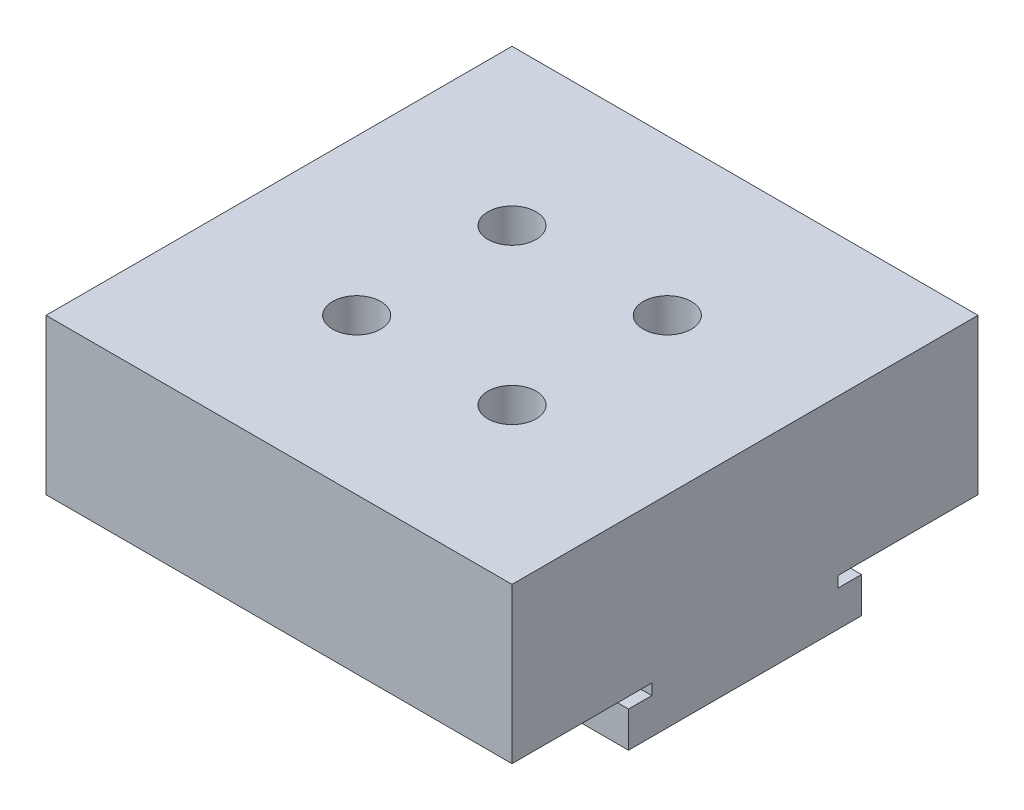
ISO-10303-21;
HEADER;
FILE_DESCRIPTION(('STEP AP214'),'2;1');
FILE_NAME('part.step','',(''),(''),'','','');
FILE_SCHEMA(('AUTOMOTIVE_DESIGN { 1 0 10303 214 1 1 1 1 }'));
ENDSEC;
DATA;
#1=APPLICATION_CONTEXT('core data for automotive mechanical design processes');
#2=APPLICATION_PROTOCOL_DEFINITION('international standard','automotive_design',2000,#1);
#3=PRODUCT_CONTEXT('',#1,'mechanical');
#4=PRODUCT('Part','Part','',(#3));
#5=PRODUCT_RELATED_PRODUCT_CATEGORY('part','',(#4));
#6=PRODUCT_DEFINITION_FORMATION('','',#4);
#7=PRODUCT_DEFINITION_CONTEXT('part definition',#1,'design');
#8=PRODUCT_DEFINITION('design','',#6,#7);
#9=PRODUCT_DEFINITION_SHAPE('','',#8);
#10=(LENGTH_UNIT() NAMED_UNIT(*) SI_UNIT(.MILLI.,.METRE.));
#11=(NAMED_UNIT(*) PLANE_ANGLE_UNIT() SI_UNIT($,.RADIAN.));
#12=(NAMED_UNIT(*) SI_UNIT($,.STERADIAN.) SOLID_ANGLE_UNIT());
#13=UNCERTAINTY_MEASURE_WITH_UNIT(LENGTH_MEASURE(1.E-05),#10,'distance_accuracy_value','');
#14=(GEOMETRIC_REPRESENTATION_CONTEXT(3) GLOBAL_UNCERTAINTY_ASSIGNED_CONTEXT((#13)) GLOBAL_UNIT_ASSIGNED_CONTEXT((#10,
#11,#12)) REPRESENTATION_CONTEXT('',''));
#15=CARTESIAN_POINT('',(0.,0.,0.));
#16=DIRECTION('',(0.,0.,1.));
#17=DIRECTION('',(1.,0.,0.));
#18=AXIS2_PLACEMENT_3D('',#15,#16,#17);
#19=CARTESIAN_POINT('',(0.,0.,0.));
#20=DIRECTION('',(0.,-1.,0.));
#21=DIRECTION('',(0.,0.,-1.));
#22=AXIS2_PLACEMENT_3D('',#19,#20,#21);
#23=PLANE('',#22);
#24=CARTESIAN_POINT('',(0.,0.,0.));
#25=DIRECTION('',(0.,-1.,0.));
#26=DIRECTION('',(0.,0.,-1.));
#27=AXIS2_PLACEMENT_3D('',#24,#25,#26);
#28=CIRCLE('',#27,3.);
#29=CARTESIAN_POINT('',(0.,0.,-3.));
#30=VERTEX_POINT('',#29);
#31=EDGE_CURVE('E206',#30,#30,#28,.T.);
#32=ORIENTED_EDGE('',*,*,#31,.F.);
#33=EDGE_LOOP('',(#32));
#34=FACE_BOUND('',#33,.T.);
#35=CARTESIAN_POINT('',(-5.,0.,-5.));
#36=DIRECTION('',(0.,-1.,0.));
#37=DIRECTION('',(0.,0.,-1.));
#38=AXIS2_PLACEMENT_3D('',#35,#36,#37);
#39=CIRCLE('',#38,3.5);
#40=CARTESIAN_POINT('',(-5.,0.,-8.5));
#41=VERTEX_POINT('',#40);
#42=EDGE_CURVE('E328',#41,#41,#39,.T.);
#43=ORIENTED_EDGE('',*,*,#42,.F.);
#44=EDGE_LOOP('',(#43));
#45=FACE_BOUND('',#44,.T.);
#46=CARTESIAN_POINT('',(5.,0.,-5.));
#47=DIRECTION('',(0.,-1.,0.));
#48=DIRECTION('',(0.,0.,-1.));
#49=AXIS2_PLACEMENT_3D('',#46,#47,#48);
#50=CIRCLE('',#49,3.5);
#51=CARTESIAN_POINT('',(5.,0.,-8.5));
#52=VERTEX_POINT('',#51);
#53=EDGE_CURVE('E342',#52,#52,#50,.T.);
#54=ORIENTED_EDGE('',*,*,#53,.F.);
#55=EDGE_LOOP('',(#54));
#56=FACE_BOUND('',#55,.T.);
#57=CARTESIAN_POINT('',(5.,0.,5.));
#58=DIRECTION('',(0.,-1.,0.));
#59=DIRECTION('',(0.,0.,-1.));
#60=AXIS2_PLACEMENT_3D('',#57,#58,#59);
#61=CIRCLE('',#60,3.5);
#62=CARTESIAN_POINT('',(5.,0.,1.5));
#63=VERTEX_POINT('',#62);
#64=EDGE_CURVE('E334',#63,#63,#61,.T.);
#65=ORIENTED_EDGE('',*,*,#64,.F.);
#66=EDGE_LOOP('',(#65));
#67=FACE_BOUND('',#66,.T.);
#68=CARTESIAN_POINT('',(-5.,0.,5.));
#69=DIRECTION('',(0.,-1.,0.));
#70=DIRECTION('',(0.,0.,-1.));
#71=AXIS2_PLACEMENT_3D('',#68,#69,#70);
#72=CIRCLE('',#71,3.5);
#73=CARTESIAN_POINT('',(-5.,0.,1.5));
#74=VERTEX_POINT('',#73);
#75=EDGE_CURVE('E333',#74,#74,#72,.T.);
#76=ORIENTED_EDGE('',*,*,#75,.F.);
#77=EDGE_LOOP('',(#76));
#78=FACE_BOUND('',#77,.T.);
#79=DIRECTION('',(-1.,0.,0.));
#80=VECTOR('',#79,1.);
#81=CARTESIAN_POINT('',(15.,0.,-6.));
#82=LINE('',#81,#80);
#83=CARTESIAN_POINT('',(15.,0.,-6.));
#84=VERTEX_POINT('',#83);
#85=CARTESIAN_POINT('',(9.00000000000001,0.,-6.));
#86=VERTEX_POINT('',#85);
#87=EDGE_CURVE('E189',#84,#86,#82,.T.);
#88=ORIENTED_EDGE('',*,*,#87,.T.);
#89=DIRECTION('',(0.,0.,-1.));
#90=VECTOR('',#89,1.);
#91=CARTESIAN_POINT('',(9.,0.,7.5));
#92=LINE('',#91,#90);
#93=CARTESIAN_POINT('',(9.,0.,6.));
#94=VERTEX_POINT('',#93);
#95=EDGE_CURVE('E264',#94,#86,#92,.T.);
#96=ORIENTED_EDGE('',*,*,#95,.F.);
#97=DIRECTION('',(-1.,0.,0.));
#98=VECTOR('',#97,1.);
#99=CARTESIAN_POINT('',(15.,0.,6.));
#100=LINE('',#99,#98);
#101=CARTESIAN_POINT('',(15.,0.,6.));
#102=VERTEX_POINT('',#101);
#103=EDGE_CURVE('E243',#102,#94,#100,.T.);
#104=ORIENTED_EDGE('',*,*,#103,.F.);
#105=DIRECTION('',(0.,0.,-1.));
#106=VECTOR('',#105,1.);
#107=CARTESIAN_POINT('',(15.,0.,15.));
#108=LINE('',#107,#106);
#109=CARTESIAN_POINT('',(15.,0.,15.));
#110=VERTEX_POINT('',#109);
#111=EDGE_CURVE('E394',#110,#102,#108,.T.);
#112=ORIENTED_EDGE('',*,*,#111,.F.);
#113=DIRECTION('',(1.,0.,0.));
#114=VECTOR('',#113,1.);
#115=CARTESIAN_POINT('',(-15.,0.,15.));
#116=LINE('',#115,#114);
#117=CARTESIAN_POINT('',(-15.,0.,15.));
#118=VERTEX_POINT('',#117);
#119=EDGE_CURVE('E384',#118,#110,#116,.T.);
#120=ORIENTED_EDGE('',*,*,#119,.F.);
#121=DIRECTION('',(0.,0.,1.));
#122=VECTOR('',#121,1.);
#123=CARTESIAN_POINT('',(-15.,0.,15.));
#124=LINE('',#123,#122);
#125=CARTESIAN_POINT('',(-15.,0.,6.));
#126=VERTEX_POINT('',#125);
#127=EDGE_CURVE('E400',#126,#118,#124,.T.);
#128=ORIENTED_EDGE('',*,*,#127,.F.);
#129=CARTESIAN_POINT('',(-9.,0.,6.));
#130=VERTEX_POINT('',#129);
#131=EDGE_CURVE('E226',#130,#126,#100,.T.);
#132=ORIENTED_EDGE('',*,*,#131,.F.);
#133=DIRECTION('',(0.,0.,1.));
#134=VECTOR('',#133,1.);
#135=CARTESIAN_POINT('',(-9.,0.,7.5));
#136=LINE('',#135,#134);
#137=CARTESIAN_POINT('',(-8.99999999999999,0.,-6.));
#138=VERTEX_POINT('',#137);
#139=EDGE_CURVE('E295',#138,#130,#136,.T.);
#140=ORIENTED_EDGE('',*,*,#139,.F.);
#141=CARTESIAN_POINT('',(-15.,0.,-6.));
#142=VERTEX_POINT('',#141);
#143=EDGE_CURVE('E182',#138,#142,#82,.T.);
#144=ORIENTED_EDGE('',*,*,#143,.T.);
#145=CARTESIAN_POINT('',(-15.,0.,-15.));
#146=VERTEX_POINT('',#145);
#147=EDGE_CURVE('E401',#146,#142,#124,.T.);
#148=ORIENTED_EDGE('',*,*,#147,.F.);
#149=DIRECTION('',(-1.,0.,0.));
#150=VECTOR('',#149,1.);
#151=CARTESIAN_POINT('',(-15.,0.,-15.));
#152=LINE('',#151,#150);
#153=CARTESIAN_POINT('',(15.,0.,-15.));
#154=VERTEX_POINT('',#153);
#155=EDGE_CURVE('E397',#154,#146,#152,.T.);
#156=ORIENTED_EDGE('',*,*,#155,.F.);
#157=EDGE_CURVE('E378',#84,#154,#108,.T.);
#158=ORIENTED_EDGE('',*,*,#157,.F.);
#159=EDGE_LOOP('',(#88,#96,#104,#112,#120,#128,#132,#140,#144,#148,#156,#158));
#160=FACE_BOUND('',#159,.T.);
#161=ADVANCED_FACE('F39',(#34,#45,#56,#67,#78,#160),#23,.T.);
#162=CARTESIAN_POINT('',(-5.,10.,-5.));
#163=DIRECTION('',(0.,-1.,0.));
#164=DIRECTION('',(0.,0.,-1.));
#165=AXIS2_PLACEMENT_3D('',#162,#163,#164);
#166=CYLINDRICAL_SURFACE('',#165,1.55);
#167=CARTESIAN_POINT('',(-5.,10.,-5.));
#168=DIRECTION('',(0.,1.,0.));
#169=DIRECTION('',(0.,0.,1.));
#170=AXIS2_PLACEMENT_3D('',#167,#168,#169);
#171=CIRCLE('',#170,1.55);
#172=CARTESIAN_POINT('',(-5.,10.,-3.45));
#173=VERTEX_POINT('',#172);
#174=EDGE_CURVE('E374',#173,#173,#171,.T.);
#175=ORIENTED_EDGE('',*,*,#174,.T.);
#176=EDGE_LOOP('',(#175));
#177=FACE_BOUND('',#176,.T.);
#178=CARTESIAN_POINT('',(-5.,3.,-5.));
#179=DIRECTION('',(0.,-1.,0.));
#180=DIRECTION('',(0.,0.,-1.));
#181=AXIS2_PLACEMENT_3D('',#178,#179,#180);
#182=CIRCLE('',#181,1.55);
#183=CARTESIAN_POINT('',(-5.,3.,-6.55));
#184=VERTEX_POINT('',#183);
#185=EDGE_CURVE('E366',#184,#184,#182,.T.);
#186=ORIENTED_EDGE('',*,*,#185,.T.);
#187=EDGE_LOOP('',(#186));
#188=FACE_BOUND('',#187,.T.);
#189=ADVANCED_FACE('F475',(#177,#188),#166,.F.);
#190=CARTESIAN_POINT('',(5.,10.,-5.));
#191=DIRECTION('',(0.,-1.,0.));
#192=DIRECTION('',(0.,0.,-1.));
#193=AXIS2_PLACEMENT_3D('',#190,#191,#192);
#194=CYLINDRICAL_SURFACE('',#193,1.55);
#195=CARTESIAN_POINT('',(5.,10.,-5.));
#196=DIRECTION('',(0.,1.,0.));
#197=DIRECTION('',(0.,0.,1.));
#198=AXIS2_PLACEMENT_3D('',#195,#196,#197);
#199=CIRCLE('',#198,1.55);
#200=CARTESIAN_POINT('',(5.,10.,-3.45));
#201=VERTEX_POINT('',#200);
#202=EDGE_CURVE('E370',#201,#201,#199,.T.);
#203=ORIENTED_EDGE('',*,*,#202,.T.);
#204=EDGE_LOOP('',(#203));
#205=FACE_BOUND('',#204,.T.);
#206=CARTESIAN_POINT('',(5.,3.,-5.));
#207=DIRECTION('',(0.,-1.,0.));
#208=DIRECTION('',(0.,0.,-1.));
#209=AXIS2_PLACEMENT_3D('',#206,#207,#208);
#210=CIRCLE('',#209,1.55);
#211=CARTESIAN_POINT('',(5.,3.,-6.55));
#212=VERTEX_POINT('',#211);
#213=EDGE_CURVE('E429',#212,#212,#210,.T.);
#214=ORIENTED_EDGE('',*,*,#213,.T.);
#215=EDGE_LOOP('',(#214));
#216=FACE_BOUND('',#215,.T.);
#217=ADVANCED_FACE('F483',(#205,#216),#194,.F.);
#218=CARTESIAN_POINT('',(5.,10.,5.));
#219=DIRECTION('',(0.,-1.,0.));
#220=DIRECTION('',(0.,0.,-1.));
#221=AXIS2_PLACEMENT_3D('',#218,#219,#220);
#222=CYLINDRICAL_SURFACE('',#221,1.55);
#223=CARTESIAN_POINT('',(5.,10.,5.));
#224=DIRECTION('',(0.,1.,0.));
#225=DIRECTION('',(0.,0.,1.));
#226=AXIS2_PLACEMENT_3D('',#223,#224,#225);
#227=CIRCLE('',#226,1.55);
#228=CARTESIAN_POINT('',(5.,10.,6.55));
#229=VERTEX_POINT('',#228);
#230=EDGE_CURVE('E365',#229,#229,#227,.T.);
#231=ORIENTED_EDGE('',*,*,#230,.T.);
#232=EDGE_LOOP('',(#231));
#233=FACE_BOUND('',#232,.T.);
#234=CARTESIAN_POINT('',(5.,3.,5.));
#235=DIRECTION('',(0.,-1.,0.));
#236=DIRECTION('',(0.,0.,-1.));
#237=AXIS2_PLACEMENT_3D('',#234,#235,#236);
#238=CIRCLE('',#237,1.55);
#239=CARTESIAN_POINT('',(5.,3.,3.45));
#240=VERTEX_POINT('',#239);
#241=EDGE_CURVE('E425',#240,#240,#238,.T.);
#242=ORIENTED_EDGE('',*,*,#241,.T.);
#243=EDGE_LOOP('',(#242));
#244=FACE_BOUND('',#243,.T.);
#245=ADVANCED_FACE('F746',(#233,#244),#222,.F.);
#246=CARTESIAN_POINT('',(-5.,10.,5.));
#247=DIRECTION('',(0.,-1.,0.));
#248=DIRECTION('',(0.,0.,-1.));
#249=AXIS2_PLACEMENT_3D('',#246,#247,#248);
#250=CYLINDRICAL_SURFACE('',#249,1.55);
#251=CARTESIAN_POINT('',(-5.,10.,5.));
#252=DIRECTION('',(0.,1.,0.));
#253=DIRECTION('',(0.,0.,1.));
#254=AXIS2_PLACEMENT_3D('',#251,#252,#253);
#255=CIRCLE('',#254,1.55);
#256=CARTESIAN_POINT('',(-5.,10.,6.55));
#257=VERTEX_POINT('',#256);
#258=EDGE_CURVE('E361',#257,#257,#255,.T.);
#259=ORIENTED_EDGE('',*,*,#258,.T.);
#260=EDGE_LOOP('',(#259));
#261=FACE_BOUND('',#260,.T.);
#262=CARTESIAN_POINT('',(-5.,3.,5.));
#263=DIRECTION('',(0.,-1.,0.));
#264=DIRECTION('',(0.,0.,-1.));
#265=AXIS2_PLACEMENT_3D('',#262,#263,#264);
#266=CIRCLE('',#265,1.55);
#267=CARTESIAN_POINT('',(-5.,3.,3.45));
#268=VERTEX_POINT('',#267);
#269=EDGE_CURVE('E357',#268,#268,#266,.T.);
#270=ORIENTED_EDGE('',*,*,#269,.T.);
#271=EDGE_LOOP('',(#270));
#272=FACE_BOUND('',#271,.T.);
#273=ADVANCED_FACE('F741',(#261,#272),#250,.F.);
#274=CARTESIAN_POINT('',(0.,10.,0.));
#275=DIRECTION('',(0.,-1.,0.));
#276=DIRECTION('',(0.,0.,-1.));
#277=AXIS2_PLACEMENT_3D('',#274,#275,#276);
#278=PLANE('',#277);
#279=DIRECTION('',(0.,0.,-1.));
#280=VECTOR('',#279,1.);
#281=CARTESIAN_POINT('',(15.,10.,15.));
#282=LINE('',#281,#280);
#283=CARTESIAN_POINT('',(15.,10.,15.));
#284=VERTEX_POINT('',#283);
#285=CARTESIAN_POINT('',(15.,10.,-15.));
#286=VERTEX_POINT('',#285);
#287=EDGE_CURVE('E379',#284,#286,#282,.T.);
#288=ORIENTED_EDGE('',*,*,#287,.T.);
#289=DIRECTION('',(-1.,0.,0.));
#290=VECTOR('',#289,1.);
#291=CARTESIAN_POINT('',(-15.,10.,-15.));
#292=LINE('',#291,#290);
#293=CARTESIAN_POINT('',(-15.,10.,-15.));
#294=VERTEX_POINT('',#293);
#295=EDGE_CURVE('E383',#286,#294,#292,.T.);
#296=ORIENTED_EDGE('',*,*,#295,.T.);
#297=DIRECTION('',(0.,0.,1.));
#298=VECTOR('',#297,1.);
#299=CARTESIAN_POINT('',(-15.,10.,15.));
#300=LINE('',#299,#298);
#301=CARTESIAN_POINT('',(-15.,10.,15.));
#302=VERTEX_POINT('',#301);
#303=EDGE_CURVE('E387',#294,#302,#300,.T.);
#304=ORIENTED_EDGE('',*,*,#303,.T.);
#305=DIRECTION('',(1.,0.,0.));
#306=VECTOR('',#305,1.);
#307=CARTESIAN_POINT('',(-15.,10.,15.));
#308=LINE('',#307,#306);
#309=EDGE_CURVE('E390',#302,#284,#308,.T.);
#310=ORIENTED_EDGE('',*,*,#309,.T.);
#311=EDGE_LOOP('',(#288,#296,#304,#310));
#312=FACE_BOUND('',#311,.T.);
#313=ORIENTED_EDGE('',*,*,#174,.F.);
#314=EDGE_LOOP('',(#313));
#315=FACE_BOUND('',#314,.T.);
#316=ORIENTED_EDGE('',*,*,#202,.F.);
#317=EDGE_LOOP('',(#316));
#318=FACE_BOUND('',#317,.T.);
#319=ORIENTED_EDGE('',*,*,#230,.F.);
#320=EDGE_LOOP('',(#319));
#321=FACE_BOUND('',#320,.T.);
#322=ORIENTED_EDGE('',*,*,#258,.F.);
#323=EDGE_LOOP('',(#322));
#324=FACE_BOUND('',#323,.T.);
#325=ADVANCED_FACE('F490',(#312,#315,#318,#321,#324),#278,.F.);
#326=CARTESIAN_POINT('',(15.,10.,15.));
#327=DIRECTION('',(-1.,0.,0.));
#328=DIRECTION('',(0.,0.,1.));
#329=AXIS2_PLACEMENT_3D('',#326,#327,#328);
#330=PLANE('',#329);
#331=DIRECTION('',(0.,1.,0.));
#332=VECTOR('',#331,1.);
#333=CARTESIAN_POINT('',(15.,0.,-6.));
#334=LINE('',#333,#332);
#335=CARTESIAN_POINT('',(15.,-0.7,-6.));
#336=VERTEX_POINT('',#335);
#337=EDGE_CURVE('E186',#336,#84,#334,.T.);
#338=ORIENTED_EDGE('',*,*,#337,.T.);
#339=ORIENTED_EDGE('',*,*,#157,.T.);
#340=DIRECTION('',(0.,-1.,0.));
#341=VECTOR('',#340,1.);
#342=CARTESIAN_POINT('',(15.,10.,-15.));
#343=LINE('',#342,#341);
#344=EDGE_CURVE('E417',#286,#154,#343,.T.);
#345=ORIENTED_EDGE('',*,*,#344,.F.);
#346=ORIENTED_EDGE('',*,*,#287,.F.);
#347=DIRECTION('',(0.,-1.,0.));
#348=VECTOR('',#347,1.);
#349=CARTESIAN_POINT('',(15.,10.,15.));
#350=LINE('',#349,#348);
#351=EDGE_CURVE('E393',#284,#110,#350,.T.);
#352=ORIENTED_EDGE('',*,*,#351,.T.);
#353=ORIENTED_EDGE('',*,*,#111,.T.);
#354=DIRECTION('',(0.,-1.,0.));
#355=VECTOR('',#354,1.);
#356=CARTESIAN_POINT('',(15.,0.,6.));
#357=LINE('',#356,#355);
#358=CARTESIAN_POINT('',(15.,-0.7,6.));
#359=VERTEX_POINT('',#358);
#360=EDGE_CURVE('E217',#102,#359,#357,.T.);
#361=ORIENTED_EDGE('',*,*,#360,.T.);
#362=DIRECTION('',(0.,0.,1.));
#363=VECTOR('',#362,1.);
#364=CARTESIAN_POINT('',(15.,-0.7,7.5));
#365=LINE('',#364,#363);
#366=CARTESIAN_POINT('',(15.,-0.7,7.5));
#367=VERTEX_POINT('',#366);
#368=EDGE_CURVE('E221',#359,#367,#365,.T.);
#369=ORIENTED_EDGE('',*,*,#368,.T.);
#370=DIRECTION('',(0.,1.,0.));
#371=VECTOR('',#370,1.);
#372=CARTESIAN_POINT('',(15.,-3.,7.5));
#373=LINE('',#372,#371);
#374=CARTESIAN_POINT('',(15.,-3.,7.5));
#375=VERTEX_POINT('',#374);
#376=EDGE_CURVE('E291',#375,#367,#373,.T.);
#377=ORIENTED_EDGE('',*,*,#376,.F.);
#378=DIRECTION('',(0.,0.,1.));
#379=VECTOR('',#378,1.);
#380=CARTESIAN_POINT('',(15.,-3.,7.5));
#381=LINE('',#380,#379);
#382=CARTESIAN_POINT('',(15.,-3.,-7.5));
#383=VERTEX_POINT('',#382);
#384=EDGE_CURVE('E265',#383,#375,#381,.T.);
#385=ORIENTED_EDGE('',*,*,#384,.F.);
#386=DIRECTION('',(0.,1.,0.));
#387=VECTOR('',#386,1.);
#388=CARTESIAN_POINT('',(15.,-3.,-7.5));
#389=LINE('',#388,#387);
#390=CARTESIAN_POINT('',(15.,-0.7,-7.5));
#391=VERTEX_POINT('',#390);
#392=EDGE_CURVE('E197',#383,#391,#389,.T.);
#393=ORIENTED_EDGE('',*,*,#392,.T.);
#394=DIRECTION('',(0.,0.,1.));
#395=VECTOR('',#394,1.);
#396=CARTESIAN_POINT('',(15.,-0.7,-7.5));
#397=LINE('',#396,#395);
#398=EDGE_CURVE('E63',#391,#336,#397,.T.);
#399=ORIENTED_EDGE('',*,*,#398,.T.);
#400=EDGE_LOOP('',(#338,#339,#345,#346,#352,#353,#361,#369,#377,#385,#393,#399));
#401=FACE_BOUND('',#400,.T.);
#402=ADVANCED_FACE('F41',(#401),#330,.F.);
#403=CARTESIAN_POINT('',(-15.,10.,-15.));
#404=DIRECTION('',(0.,0.,1.));
#405=DIRECTION('',(1.,0.,0.));
#406=AXIS2_PLACEMENT_3D('',#403,#404,#405);
#407=PLANE('',#406);
#408=ORIENTED_EDGE('',*,*,#155,.T.);
#409=DIRECTION('',(0.,-1.,0.));
#410=VECTOR('',#409,1.);
#411=CARTESIAN_POINT('',(-15.,10.,-15.));
#412=LINE('',#411,#410);
#413=EDGE_CURVE('E413',#294,#146,#412,.T.);
#414=ORIENTED_EDGE('',*,*,#413,.F.);
#415=ORIENTED_EDGE('',*,*,#295,.F.);
#416=ORIENTED_EDGE('',*,*,#344,.T.);
#417=EDGE_LOOP('',(#408,#414,#415,#416));
#418=FACE_BOUND('',#417,.T.);
#419=ADVANCED_FACE('F498',(#418),#407,.F.);
#420=CARTESIAN_POINT('',(-15.,10.,15.));
#421=DIRECTION('',(1.,0.,0.));
#422=DIRECTION('',(0.,0.,-1.));
#423=AXIS2_PLACEMENT_3D('',#420,#421,#422);
#424=PLANE('',#423);
#425=ORIENTED_EDGE('',*,*,#147,.T.);
#426=DIRECTION('',(0.,1.,0.));
#427=VECTOR('',#426,1.);
#428=CARTESIAN_POINT('',(-15.,0.,-6.));
#429=LINE('',#428,#427);
#430=CARTESIAN_POINT('',(-15.,-0.7,-6.));
#431=VERTEX_POINT('',#430);
#432=EDGE_CURVE('E199',#431,#142,#429,.T.);
#433=ORIENTED_EDGE('',*,*,#432,.F.);
#434=DIRECTION('',(0.,0.,1.));
#435=VECTOR('',#434,1.);
#436=CARTESIAN_POINT('',(-15.,-0.7,-7.5));
#437=LINE('',#436,#435);
#438=CARTESIAN_POINT('',(-15.,-0.7,-7.5));
#439=VERTEX_POINT('',#438);
#440=EDGE_CURVE('E203',#439,#431,#437,.T.);
#441=ORIENTED_EDGE('',*,*,#440,.F.);
#442=DIRECTION('',(0.,1.,0.));
#443=VECTOR('',#442,1.);
#444=CARTESIAN_POINT('',(-15.,-3.,-7.5));
#445=LINE('',#444,#443);
#446=CARTESIAN_POINT('',(-15.,-3.,-7.5));
#447=VERTEX_POINT('',#446);
#448=EDGE_CURVE('E324',#447,#439,#445,.T.);
#449=ORIENTED_EDGE('',*,*,#448,.F.);
#450=DIRECTION('',(0.,0.,-1.));
#451=VECTOR('',#450,1.);
#452=CARTESIAN_POINT('',(-15.,-3.,7.5));
#453=LINE('',#452,#451);
#454=CARTESIAN_POINT('',(-15.,-3.,7.5));
#455=VERTEX_POINT('',#454);
#456=EDGE_CURVE('E296',#455,#447,#453,.T.);
#457=ORIENTED_EDGE('',*,*,#456,.F.);
#458=DIRECTION('',(0.,1.,0.));
#459=VECTOR('',#458,1.);
#460=CARTESIAN_POINT('',(-15.,-3.,7.5));
#461=LINE('',#460,#459);
#462=CARTESIAN_POINT('',(-15.,-0.7,7.5));
#463=VERTEX_POINT('',#462);
#464=EDGE_CURVE('E309',#455,#463,#461,.T.);
#465=ORIENTED_EDGE('',*,*,#464,.T.);
#466=DIRECTION('',(0.,0.,1.));
#467=VECTOR('',#466,1.);
#468=CARTESIAN_POINT('',(-15.,-0.7,7.5));
#469=LINE('',#468,#467);
#470=CARTESIAN_POINT('',(-15.,-0.7,6.));
#471=VERTEX_POINT('',#470);
#472=EDGE_CURVE('E222',#471,#463,#469,.T.);
#473=ORIENTED_EDGE('',*,*,#472,.F.);
#474=DIRECTION('',(0.,-1.,0.));
#475=VECTOR('',#474,1.);
#476=CARTESIAN_POINT('',(-15.,0.,6.));
#477=LINE('',#476,#475);
#478=EDGE_CURVE('E227',#126,#471,#477,.T.);
#479=ORIENTED_EDGE('',*,*,#478,.F.);
#480=ORIENTED_EDGE('',*,*,#127,.T.);
#481=DIRECTION('',(0.,-1.,0.));
#482=VECTOR('',#481,1.);
#483=CARTESIAN_POINT('',(-15.,10.,15.));
#484=LINE('',#483,#482);
#485=EDGE_CURVE('E409',#302,#118,#484,.T.);
#486=ORIENTED_EDGE('',*,*,#485,.F.);
#487=ORIENTED_EDGE('',*,*,#303,.F.);
#488=ORIENTED_EDGE('',*,*,#413,.T.);
#489=EDGE_LOOP('',(#425,#433,#441,#449,#457,#465,#473,#479,#480,#486,#487,#488));
#490=FACE_BOUND('',#489,.T.);
#491=ADVANCED_FACE('F495',(#490),#424,.F.);
#492=CARTESIAN_POINT('',(-15.,10.,15.));
#493=DIRECTION('',(0.,0.,-1.));
#494=DIRECTION('',(-1.,0.,0.));
#495=AXIS2_PLACEMENT_3D('',#492,#493,#494);
#496=PLANE('',#495);
#497=ORIENTED_EDGE('',*,*,#119,.T.);
#498=ORIENTED_EDGE('',*,*,#351,.F.);
#499=ORIENTED_EDGE('',*,*,#309,.F.);
#500=ORIENTED_EDGE('',*,*,#485,.T.);
#501=EDGE_LOOP('',(#497,#498,#499,#500));
#502=FACE_BOUND('',#501,.T.);
#503=ADVANCED_FACE('F491',(#502),#496,.F.);
#504=CARTESIAN_POINT('',(-5.,3.,5.));
#505=DIRECTION('',(0.,-1.,0.));
#506=DIRECTION('',(0.,0.,-1.));
#507=AXIS2_PLACEMENT_3D('',#504,#505,#506);
#508=CYLINDRICAL_SURFACE('',#507,3.5);
#509=CARTESIAN_POINT('',(-5.,3.,5.));
#510=DIRECTION('',(0.,-1.,0.));
#511=DIRECTION('',(0.,0.,-1.));
#512=AXIS2_PLACEMENT_3D('',#509,#510,#511);
#513=CIRCLE('',#512,3.5);
#514=CARTESIAN_POINT('',(-5.,3.,1.5));
#515=VERTEX_POINT('',#514);
#516=EDGE_CURVE('E353',#515,#515,#513,.T.);
#517=ORIENTED_EDGE('',*,*,#516,.F.);
#518=EDGE_LOOP('',(#517));
#519=FACE_BOUND('',#518,.T.);
#520=ORIENTED_EDGE('',*,*,#75,.T.);
#521=EDGE_LOOP('',(#520));
#522=FACE_BOUND('',#521,.T.);
#523=ADVANCED_FACE('F494',(#519,#522),#508,.F.);
#524=CARTESIAN_POINT('',(-5.,3.,5.));
#525=DIRECTION('',(0.,-1.,0.));
#526=DIRECTION('',(0.,0.,-1.));
#527=AXIS2_PLACEMENT_3D('',#524,#525,#526);
#528=PLANE('',#527);
#529=ORIENTED_EDGE('',*,*,#269,.F.);
#530=EDGE_LOOP('',(#529));
#531=FACE_BOUND('',#530,.T.);
#532=ORIENTED_EDGE('',*,*,#516,.T.);
#533=EDGE_LOOP('',(#532));
#534=FACE_BOUND('',#533,.T.);
#535=ADVANCED_FACE('F670',(#531,#534),#528,.T.);
#536=CARTESIAN_POINT('',(5.,3.,5.));
#537=DIRECTION('',(0.,-1.,0.));
#538=DIRECTION('',(0.,0.,-1.));
#539=AXIS2_PLACEMENT_3D('',#536,#537,#538);
#540=CYLINDRICAL_SURFACE('',#539,3.5);
#541=CARTESIAN_POINT('',(5.,3.,5.));
#542=DIRECTION('',(0.,-1.,0.));
#543=DIRECTION('',(0.,0.,-1.));
#544=AXIS2_PLACEMENT_3D('',#541,#542,#543);
#545=CIRCLE('',#544,3.5);
#546=CARTESIAN_POINT('',(5.,3.,1.5));
#547=VERTEX_POINT('',#546);
#548=EDGE_CURVE('E329',#547,#547,#545,.T.);
#549=ORIENTED_EDGE('',*,*,#548,.F.);
#550=EDGE_LOOP('',(#549));
#551=FACE_BOUND('',#550,.T.);
#552=ORIENTED_EDGE('',*,*,#64,.T.);
#553=EDGE_LOOP('',(#552));
#554=FACE_BOUND('',#553,.T.);
#555=ADVANCED_FACE('F665',(#551,#554),#540,.F.);
#556=CARTESIAN_POINT('',(5.,3.,5.));
#557=DIRECTION('',(0.,-1.,0.));
#558=DIRECTION('',(0.,0.,-1.));
#559=AXIS2_PLACEMENT_3D('',#556,#557,#558);
#560=PLANE('',#559);
#561=ORIENTED_EDGE('',*,*,#241,.F.);
#562=EDGE_LOOP('',(#561));
#563=FACE_BOUND('',#562,.T.);
#564=ORIENTED_EDGE('',*,*,#548,.T.);
#565=EDGE_LOOP('',(#564));
#566=FACE_BOUND('',#565,.T.);
#567=ADVANCED_FACE('F657',(#563,#566),#560,.T.);
#568=CARTESIAN_POINT('',(5.,3.,-5.));
#569=DIRECTION('',(0.,-1.,0.));
#570=DIRECTION('',(0.,0.,-1.));
#571=AXIS2_PLACEMENT_3D('',#568,#569,#570);
#572=CYLINDRICAL_SURFACE('',#571,3.5);
#573=CARTESIAN_POINT('',(5.,3.,-5.));
#574=DIRECTION('',(0.,-1.,0.));
#575=DIRECTION('',(0.,0.,-1.));
#576=AXIS2_PLACEMENT_3D('',#573,#574,#575);
#577=CIRCLE('',#576,3.5);
#578=CARTESIAN_POINT('',(5.,3.,-8.5));
#579=VERTEX_POINT('',#578);
#580=EDGE_CURVE('E338',#579,#579,#577,.T.);
#581=ORIENTED_EDGE('',*,*,#580,.F.);
#582=EDGE_LOOP('',(#581));
#583=FACE_BOUND('',#582,.T.);
#584=ORIENTED_EDGE('',*,*,#53,.T.);
#585=EDGE_LOOP('',(#584));
#586=FACE_BOUND('',#585,.T.);
#587=ADVANCED_FACE('F652',(#583,#586),#572,.F.);
#588=CARTESIAN_POINT('',(5.,3.,-5.));
#589=DIRECTION('',(0.,-1.,0.));
#590=DIRECTION('',(0.,0.,-1.));
#591=AXIS2_PLACEMENT_3D('',#588,#589,#590);
#592=PLANE('',#591);
#593=ORIENTED_EDGE('',*,*,#213,.F.);
#594=EDGE_LOOP('',(#593));
#595=FACE_BOUND('',#594,.T.);
#596=ORIENTED_EDGE('',*,*,#580,.T.);
#597=EDGE_LOOP('',(#596));
#598=FACE_BOUND('',#597,.T.);
#599=ADVANCED_FACE('F643',(#595,#598),#592,.T.);
#600=CARTESIAN_POINT('',(-5.,3.,-5.));
#601=DIRECTION('',(0.,-1.,0.));
#602=DIRECTION('',(0.,0.,-1.));
#603=AXIS2_PLACEMENT_3D('',#600,#601,#602);
#604=CYLINDRICAL_SURFACE('',#603,3.5);
#605=CARTESIAN_POINT('',(-5.,3.,-5.));
#606=DIRECTION('',(0.,-1.,0.));
#607=DIRECTION('',(0.,0.,-1.));
#608=AXIS2_PLACEMENT_3D('',#605,#606,#607);
#609=CIRCLE('',#608,3.5);
#610=CARTESIAN_POINT('',(-5.,3.,-8.5));
#611=VERTEX_POINT('',#610);
#612=EDGE_CURVE('E346',#611,#611,#609,.T.);
#613=ORIENTED_EDGE('',*,*,#612,.F.);
#614=EDGE_LOOP('',(#613));
#615=FACE_BOUND('',#614,.T.);
#616=ORIENTED_EDGE('',*,*,#42,.T.);
#617=EDGE_LOOP('',(#616));
#618=FACE_BOUND('',#617,.T.);
#619=ADVANCED_FACE('F638',(#615,#618),#604,.F.);
#620=CARTESIAN_POINT('',(-5.,3.,-5.));
#621=DIRECTION('',(0.,-1.,0.));
#622=DIRECTION('',(0.,0.,-1.));
#623=AXIS2_PLACEMENT_3D('',#620,#621,#622);
#624=PLANE('',#623);
#625=ORIENTED_EDGE('',*,*,#185,.F.);
#626=EDGE_LOOP('',(#625));
#627=FACE_BOUND('',#626,.T.);
#628=ORIENTED_EDGE('',*,*,#612,.T.);
#629=EDGE_LOOP('',(#628));
#630=FACE_BOUND('',#629,.T.);
#631=ADVANCED_FACE('F631',(#627,#630),#624,.T.);
#632=CARTESIAN_POINT('',(-15.,-3.,-7.5));
#633=DIRECTION('',(0.,0.,1.));
#634=DIRECTION('',(1.,0.,0.));
#635=AXIS2_PLACEMENT_3D('',#632,#633,#634);
#636=PLANE('',#635);
#637=ORIENTED_EDGE('',*,*,#448,.T.);
#638=DIRECTION('',(-1.,0.,0.));
#639=VECTOR('',#638,1.);
#640=CARTESIAN_POINT('',(15.,-0.7,-7.5));
#641=LINE('',#640,#639);
#642=CARTESIAN_POINT('',(-8.99999999999999,-0.7,-7.5));
#643=VERTEX_POINT('',#642);
#644=EDGE_CURVE('E192',#643,#439,#641,.T.);
#645=ORIENTED_EDGE('',*,*,#644,.F.);
#646=DIRECTION('',(0.,1.,0.));
#647=VECTOR('',#646,1.);
#648=CARTESIAN_POINT('',(-8.99999999999999,-3.,-7.5));
#649=LINE('',#648,#647);
#650=CARTESIAN_POINT('',(-8.99999999999999,-3.,-7.5));
#651=VERTEX_POINT('',#650);
#652=EDGE_CURVE('E320',#651,#643,#649,.T.);
#653=ORIENTED_EDGE('',*,*,#652,.F.);
#654=DIRECTION('',(1.,0.,0.));
#655=VECTOR('',#654,1.);
#656=CARTESIAN_POINT('',(-15.,-3.,-7.5));
#657=LINE('',#656,#655);
#658=EDGE_CURVE('E300',#447,#651,#657,.T.);
#659=ORIENTED_EDGE('',*,*,#658,.F.);
#660=EDGE_LOOP('',(#637,#645,#653,#659));
#661=FACE_BOUND('',#660,.T.);
#662=ADVANCED_FACE('F523',(#661),#636,.F.);
#663=CARTESIAN_POINT('',(-9.,-3.,7.5));
#664=DIRECTION('',(-1.,0.,0.));
#665=DIRECTION('',(0.,0.,1.));
#666=AXIS2_PLACEMENT_3D('',#663,#664,#665);
#667=PLANE('',#666);
#668=DIRECTION('',(0.,0.,1.));
#669=VECTOR('',#668,1.);
#670=CARTESIAN_POINT('',(-9.,-0.7,7.5));
#671=LINE('',#670,#669);
#672=CARTESIAN_POINT('',(-8.99999999999999,-0.7,-6.));
#673=VERTEX_POINT('',#672);
#674=EDGE_CURVE('E248',#643,#673,#671,.T.);
#675=ORIENTED_EDGE('',*,*,#674,.T.);
#676=DIRECTION('',(0.,1.,0.));
#677=VECTOR('',#676,1.);
#678=CARTESIAN_POINT('',(-8.99999999999999,-3.,-6.));
#679=LINE('',#678,#677);
#680=EDGE_CURVE('E260',#673,#138,#679,.T.);
#681=ORIENTED_EDGE('',*,*,#680,.T.);
#682=ORIENTED_EDGE('',*,*,#139,.T.);
#683=DIRECTION('',(0.,-1.,0.));
#684=VECTOR('',#683,1.);
#685=CARTESIAN_POINT('',(-9.,-3.,6.));
#686=LINE('',#685,#684);
#687=CARTESIAN_POINT('',(-9.,-0.7,6.));
#688=VERTEX_POINT('',#687);
#689=EDGE_CURVE('E252',#130,#688,#686,.T.);
#690=ORIENTED_EDGE('',*,*,#689,.T.);
#691=DIRECTION('',(0.,0.,1.));
#692=VECTOR('',#691,1.);
#693=CARTESIAN_POINT('',(-9.,-0.7,7.5));
#694=LINE('',#693,#692);
#695=CARTESIAN_POINT('',(-9.,-0.7,7.5));
#696=VERTEX_POINT('',#695);
#697=EDGE_CURVE('E256',#688,#696,#694,.T.);
#698=ORIENTED_EDGE('',*,*,#697,.T.);
#699=DIRECTION('',(0.,1.,0.));
#700=VECTOR('',#699,1.);
#701=CARTESIAN_POINT('',(-9.,-3.,7.5));
#702=LINE('',#701,#700);
#703=CARTESIAN_POINT('',(-9.,-3.,7.5));
#704=VERTEX_POINT('',#703);
#705=EDGE_CURVE('E316',#704,#696,#702,.T.);
#706=ORIENTED_EDGE('',*,*,#705,.F.);
#707=DIRECTION('',(0.,0.,1.));
#708=VECTOR('',#707,1.);
#709=CARTESIAN_POINT('',(-9.,-3.,7.5));
#710=LINE('',#709,#708);
#711=EDGE_CURVE('E303',#651,#704,#710,.T.);
#712=ORIENTED_EDGE('',*,*,#711,.F.);
#713=ORIENTED_EDGE('',*,*,#652,.T.);
#714=EDGE_LOOP('',(#675,#681,#682,#690,#698,#706,#712,#713));
#715=FACE_BOUND('',#714,.T.);
#716=ADVANCED_FACE('F613',(#715),#667,.F.);
#717=CARTESIAN_POINT('',(-15.,-3.,7.5));
#718=DIRECTION('',(0.,0.,-1.));
#719=DIRECTION('',(-1.,0.,0.));
#720=AXIS2_PLACEMENT_3D('',#717,#718,#719);
#721=PLANE('',#720);
#722=ORIENTED_EDGE('',*,*,#705,.T.);
#723=DIRECTION('',(-1.,0.,0.));
#724=VECTOR('',#723,1.);
#725=CARTESIAN_POINT('',(15.,-0.7,7.5));
#726=LINE('',#725,#724);
#727=EDGE_CURVE('E237',#696,#463,#726,.T.);
#728=ORIENTED_EDGE('',*,*,#727,.T.);
#729=ORIENTED_EDGE('',*,*,#464,.F.);
#730=DIRECTION('',(-1.,0.,0.));
#731=VECTOR('',#730,1.);
#732=CARTESIAN_POINT('',(-15.,-3.,7.5));
#733=LINE('',#732,#731);
#734=EDGE_CURVE('E306',#704,#455,#733,.T.);
#735=ORIENTED_EDGE('',*,*,#734,.F.);
#736=EDGE_LOOP('',(#722,#728,#729,#735));
#737=FACE_BOUND('',#736,.T.);
#738=ADVANCED_FACE('F534',(#737),#721,.F.);
#739=CARTESIAN_POINT('',(0.,-3.,0.));
#740=DIRECTION('',(0.,-1.,0.));
#741=DIRECTION('',(0.,0.,-1.));
#742=AXIS2_PLACEMENT_3D('',#739,#740,#741);
#743=PLANE('',#742);
#744=ORIENTED_EDGE('',*,*,#456,.T.);
#745=ORIENTED_EDGE('',*,*,#658,.T.);
#746=ORIENTED_EDGE('',*,*,#711,.T.);
#747=ORIENTED_EDGE('',*,*,#734,.T.);
#748=EDGE_LOOP('',(#744,#745,#746,#747));
#749=FACE_BOUND('',#748,.T.);
#750=ADVANCED_FACE('F527',(#749),#743,.T.);
#751=CARTESIAN_POINT('',(15.,-3.,7.5));
#752=DIRECTION('',(0.,0.,-1.));
#753=DIRECTION('',(-1.,0.,0.));
#754=AXIS2_PLACEMENT_3D('',#751,#752,#753);
#755=PLANE('',#754);
#756=ORIENTED_EDGE('',*,*,#376,.T.);
#757=CARTESIAN_POINT('',(9.,-0.7,7.5));
#758=VERTEX_POINT('',#757);
#759=EDGE_CURVE('E210',#367,#758,#726,.T.);
#760=ORIENTED_EDGE('',*,*,#759,.T.);
#761=DIRECTION('',(0.,1.,0.));
#762=VECTOR('',#761,1.);
#763=CARTESIAN_POINT('',(9.,-3.,7.5));
#764=LINE('',#763,#762);
#765=CARTESIAN_POINT('',(9.,-3.,7.5));
#766=VERTEX_POINT('',#765);
#767=EDGE_CURVE('E287',#766,#758,#764,.T.);
#768=ORIENTED_EDGE('',*,*,#767,.F.);
#769=DIRECTION('',(-1.,0.,0.));
#770=VECTOR('',#769,1.);
#771=CARTESIAN_POINT('',(15.,-3.,7.5));
#772=LINE('',#771,#770);
#773=EDGE_CURVE('E269',#375,#766,#772,.T.);
#774=ORIENTED_EDGE('',*,*,#773,.F.);
#775=EDGE_LOOP('',(#756,#760,#768,#774));
#776=FACE_BOUND('',#775,.T.);
#777=ADVANCED_FACE('F449',(#776),#755,.F.);
#778=CARTESIAN_POINT('',(9.,-3.,7.5));
#779=DIRECTION('',(1.,0.,0.));
#780=DIRECTION('',(0.,0.,-1.));
#781=AXIS2_PLACEMENT_3D('',#778,#779,#780);
#782=PLANE('',#781);
#783=ORIENTED_EDGE('',*,*,#95,.T.);
#784=DIRECTION('',(0.,-1.,0.));
#785=VECTOR('',#784,1.);
#786=CARTESIAN_POINT('',(9.00000000000001,-3.,-6.));
#787=LINE('',#786,#785);
#788=CARTESIAN_POINT('',(9.00000000000001,-0.7,-6.));
#789=VERTEX_POINT('',#788);
#790=EDGE_CURVE('E11',#86,#789,#787,.T.);
#791=ORIENTED_EDGE('',*,*,#790,.T.);
#792=DIRECTION('',(0.,0.,-1.));
#793=VECTOR('',#792,1.);
#794=CARTESIAN_POINT('',(9.,-0.7,7.5));
#795=LINE('',#794,#793);
#796=CARTESIAN_POINT('',(9.00000000000001,-0.7,-7.5));
#797=VERTEX_POINT('',#796);
#798=EDGE_CURVE('E179',#789,#797,#795,.T.);
#799=ORIENTED_EDGE('',*,*,#798,.T.);
#800=DIRECTION('',(0.,1.,0.));
#801=VECTOR('',#800,1.);
#802=CARTESIAN_POINT('',(9.00000000000001,-3.,-7.5));
#803=LINE('',#802,#801);
#804=CARTESIAN_POINT('',(9.00000000000001,-3.,-7.5));
#805=VERTEX_POINT('',#804);
#806=EDGE_CURVE('E283',#805,#797,#803,.T.);
#807=ORIENTED_EDGE('',*,*,#806,.F.);
#808=DIRECTION('',(0.,0.,-1.));
#809=VECTOR('',#808,1.);
#810=CARTESIAN_POINT('',(9.,-3.,7.5));
#811=LINE('',#810,#809);
#812=EDGE_CURVE('E272',#766,#805,#811,.T.);
#813=ORIENTED_EDGE('',*,*,#812,.F.);
#814=ORIENTED_EDGE('',*,*,#767,.T.);
#815=DIRECTION('',(0.,0.,-1.));
#816=VECTOR('',#815,1.);
#817=CARTESIAN_POINT('',(9.,-0.7,7.5));
#818=LINE('',#817,#816);
#819=CARTESIAN_POINT('',(9.,-0.7,6.));
#820=VERTEX_POINT('',#819);
#821=EDGE_CURVE('E48',#758,#820,#818,.T.);
#822=ORIENTED_EDGE('',*,*,#821,.T.);
#823=DIRECTION('',(0.,1.,0.));
#824=VECTOR('',#823,1.);
#825=CARTESIAN_POINT('',(9.,-3.,6.));
#826=LINE('',#825,#824);
#827=EDGE_CURVE('E421',#820,#94,#826,.T.);
#828=ORIENTED_EDGE('',*,*,#827,.T.);
#829=EDGE_LOOP('',(#783,#791,#799,#807,#813,#814,#822,#828));
#830=FACE_BOUND('',#829,.T.);
#831=ADVANCED_FACE('F441',(#830),#782,.F.);
#832=CARTESIAN_POINT('',(15.,-3.,-7.5));
#833=DIRECTION('',(0.,0.,1.));
#834=DIRECTION('',(1.,0.,0.));
#835=AXIS2_PLACEMENT_3D('',#832,#833,#834);
#836=PLANE('',#835);
#837=ORIENTED_EDGE('',*,*,#806,.T.);
#838=EDGE_CURVE('E214',#391,#797,#641,.T.);
#839=ORIENTED_EDGE('',*,*,#838,.F.);
#840=ORIENTED_EDGE('',*,*,#392,.F.);
#841=DIRECTION('',(1.,0.,0.));
#842=VECTOR('',#841,1.);
#843=CARTESIAN_POINT('',(15.,-3.,-7.5));
#844=LINE('',#843,#842);
#845=EDGE_CURVE('E275',#805,#383,#844,.T.);
#846=ORIENTED_EDGE('',*,*,#845,.F.);
#847=EDGE_LOOP('',(#837,#839,#840,#846));
#848=FACE_BOUND('',#847,.T.);
#849=ADVANCED_FACE('F461',(#848),#836,.F.);
#850=CARTESIAN_POINT('',(0.,-3.,0.));
#851=DIRECTION('',(0.,1.,0.));
#852=DIRECTION('',(0.,0.,1.));
#853=AXIS2_PLACEMENT_3D('',#850,#851,#852);
#854=PLANE('',#853);
#855=ORIENTED_EDGE('',*,*,#384,.T.);
#856=ORIENTED_EDGE('',*,*,#773,.T.);
#857=ORIENTED_EDGE('',*,*,#812,.T.);
#858=ORIENTED_EDGE('',*,*,#845,.T.);
#859=EDGE_LOOP('',(#855,#856,#857,#858));
#860=FACE_BOUND('',#859,.T.);
#861=ADVANCED_FACE('F463',(#860),#854,.F.);
#862=CARTESIAN_POINT('',(15.,-0.7,-7.5));
#863=DIRECTION('',(0.,-1.,0.));
#864=DIRECTION('',(0.,0.,-1.));
#865=AXIS2_PLACEMENT_3D('',#862,#863,#864);
#866=PLANE('',#865);
#867=DIRECTION('',(-1.,0.,0.));
#868=VECTOR('',#867,1.);
#869=CARTESIAN_POINT('',(15.,-0.7,-6.));
#870=LINE('',#869,#868);
#871=EDGE_CURVE('E175',#336,#789,#870,.T.);
#872=ORIENTED_EDGE('',*,*,#871,.F.);
#873=ORIENTED_EDGE('',*,*,#398,.F.);
#874=ORIENTED_EDGE('',*,*,#838,.T.);
#875=ORIENTED_EDGE('',*,*,#798,.F.);
#876=EDGE_LOOP('',(#872,#873,#874,#875));
#877=FACE_BOUND('',#876,.T.);
#878=ADVANCED_FACE('F177',(#877),#866,.F.);
#879=CARTESIAN_POINT('',(15.,0.,-6.));
#880=DIRECTION('',(0.,0.,1.));
#881=DIRECTION('',(1.,0.,0.));
#882=AXIS2_PLACEMENT_3D('',#879,#880,#881);
#883=PLANE('',#882);
#884=ORIENTED_EDGE('',*,*,#87,.F.);
#885=ORIENTED_EDGE('',*,*,#337,.F.);
#886=ORIENTED_EDGE('',*,*,#871,.T.);
#887=ORIENTED_EDGE('',*,*,#790,.F.);
#888=EDGE_LOOP('',(#884,#885,#886,#887));
#889=FACE_BOUND('',#888,.T.);
#890=ADVANCED_FACE('F187',(#889),#883,.F.);
#891=CARTESIAN_POINT('',(15.,0.,6.));
#892=DIRECTION('',(0.,0.,-1.));
#893=DIRECTION('',(-1.,0.,0.));
#894=AXIS2_PLACEMENT_3D('',#891,#892,#893);
#895=PLANE('',#894);
#896=DIRECTION('',(-1.,0.,0.));
#897=VECTOR('',#896,1.);
#898=CARTESIAN_POINT('',(15.,-0.7,6.));
#899=LINE('',#898,#897);
#900=EDGE_CURVE('E238',#359,#820,#899,.T.);
#901=ORIENTED_EDGE('',*,*,#900,.F.);
#902=ORIENTED_EDGE('',*,*,#360,.F.);
#903=ORIENTED_EDGE('',*,*,#103,.T.);
#904=ORIENTED_EDGE('',*,*,#827,.F.);
#905=EDGE_LOOP('',(#901,#902,#903,#904));
#906=FACE_BOUND('',#905,.T.);
#907=ADVANCED_FACE('F455',(#906),#895,.F.);
#908=CARTESIAN_POINT('',(15.,-0.7,7.5));
#909=DIRECTION('',(0.,-1.,0.));
#910=DIRECTION('',(0.,0.,-1.));
#911=AXIS2_PLACEMENT_3D('',#908,#909,#910);
#912=PLANE('',#911);
#913=ORIENTED_EDGE('',*,*,#759,.F.);
#914=ORIENTED_EDGE('',*,*,#368,.F.);
#915=ORIENTED_EDGE('',*,*,#900,.T.);
#916=ORIENTED_EDGE('',*,*,#821,.F.);
#917=EDGE_LOOP('',(#913,#914,#915,#916));
#918=FACE_BOUND('',#917,.T.);
#919=ADVANCED_FACE('F446',(#918),#912,.F.);
#920=EDGE_CURVE('E242',#688,#471,#899,.T.);
#921=ORIENTED_EDGE('',*,*,#920,.T.);
#922=ORIENTED_EDGE('',*,*,#472,.T.);
#923=ORIENTED_EDGE('',*,*,#727,.F.);
#924=ORIENTED_EDGE('',*,*,#697,.F.);
#925=EDGE_LOOP('',(#921,#922,#923,#924));
#926=FACE_BOUND('',#925,.T.);
#927=ADVANCED_FACE('F561',(#926),#912,.F.);
#928=ORIENTED_EDGE('',*,*,#131,.T.);
#929=ORIENTED_EDGE('',*,*,#478,.T.);
#930=ORIENTED_EDGE('',*,*,#920,.F.);
#931=ORIENTED_EDGE('',*,*,#689,.F.);
#932=EDGE_LOOP('',(#928,#929,#930,#931));
#933=FACE_BOUND('',#932,.T.);
#934=ADVANCED_FACE('F559',(#933),#895,.F.);
#935=EDGE_CURVE('E55',#673,#431,#870,.T.);
#936=ORIENTED_EDGE('',*,*,#935,.T.);
#937=ORIENTED_EDGE('',*,*,#432,.T.);
#938=ORIENTED_EDGE('',*,*,#143,.F.);
#939=ORIENTED_EDGE('',*,*,#680,.F.);
#940=EDGE_LOOP('',(#936,#937,#938,#939));
#941=FACE_BOUND('',#940,.T.);
#942=ADVANCED_FACE('F517',(#941),#883,.F.);
#943=ORIENTED_EDGE('',*,*,#644,.T.);
#944=ORIENTED_EDGE('',*,*,#440,.T.);
#945=ORIENTED_EDGE('',*,*,#935,.F.);
#946=ORIENTED_EDGE('',*,*,#674,.F.);
#947=EDGE_LOOP('',(#943,#944,#945,#946));
#948=FACE_BOUND('',#947,.T.);
#949=ADVANCED_FACE('F471',(#948),#866,.F.);
#950=CARTESIAN_POINT('',(0.,-6.,0.));
#951=DIRECTION('',(0.,1.,0.));
#952=DIRECTION('',(0.,0.,1.));
#953=AXIS2_PLACEMENT_3D('',#950,#951,#952);
#954=CYLINDRICAL_SURFACE('',#953,3.);
#955=CARTESIAN_POINT('',(0.,-6.,0.));
#956=DIRECTION('',(0.,-1.,0.));
#957=DIRECTION('',(0.,0.,-1.));
#958=AXIS2_PLACEMENT_3D('',#955,#956,#957);
#959=CIRCLE('',#958,3.);
#960=CARTESIAN_POINT('',(0.,-6.,-3.));
#961=VERTEX_POINT('',#960);
#962=EDGE_CURVE('E231',#961,#961,#959,.T.);
#963=ORIENTED_EDGE('',*,*,#962,.F.);
#964=EDGE_LOOP('',(#963));
#965=FACE_BOUND('',#964,.T.);
#966=ORIENTED_EDGE('',*,*,#31,.T.);
#967=EDGE_LOOP('',(#966));
#968=FACE_BOUND('',#967,.T.);
#969=ADVANCED_FACE('F546',(#965,#968),#954,.T.);
#970=CARTESIAN_POINT('',(0.,-6.,0.));
#971=DIRECTION('',(0.,-1.,0.));
#972=DIRECTION('',(0.,0.,-1.));
#973=AXIS2_PLACEMENT_3D('',#970,#971,#972);
#974=PLANE('',#973);
#975=ORIENTED_EDGE('',*,*,#962,.T.);
#976=EDGE_LOOP('',(#975));
#977=FACE_BOUND('',#976,.T.);
#978=ADVANCED_FACE('F548',(#977),#974,.T.);
#979=CLOSED_SHELL('',(#161,#189,#217,#245,#273,#325,#402,#419,#491,#503,#523,#535,#555,#567,
#587,#599,#619,#631,#662,#716,#738,#750,#777,#831,#849,#861,#878,#890,#907,#919,#927,#934,#942,
#949,#969,#978));
#980=MANIFOLD_SOLID_BREP('B2',#979);
#981=ADVANCED_BREP_SHAPE_REPRESENTATION('',(#18,#980),#14);
#982=SHAPE_DEFINITION_REPRESENTATION(#9,#981);
ENDSEC;
END-ISO-10303-21;
